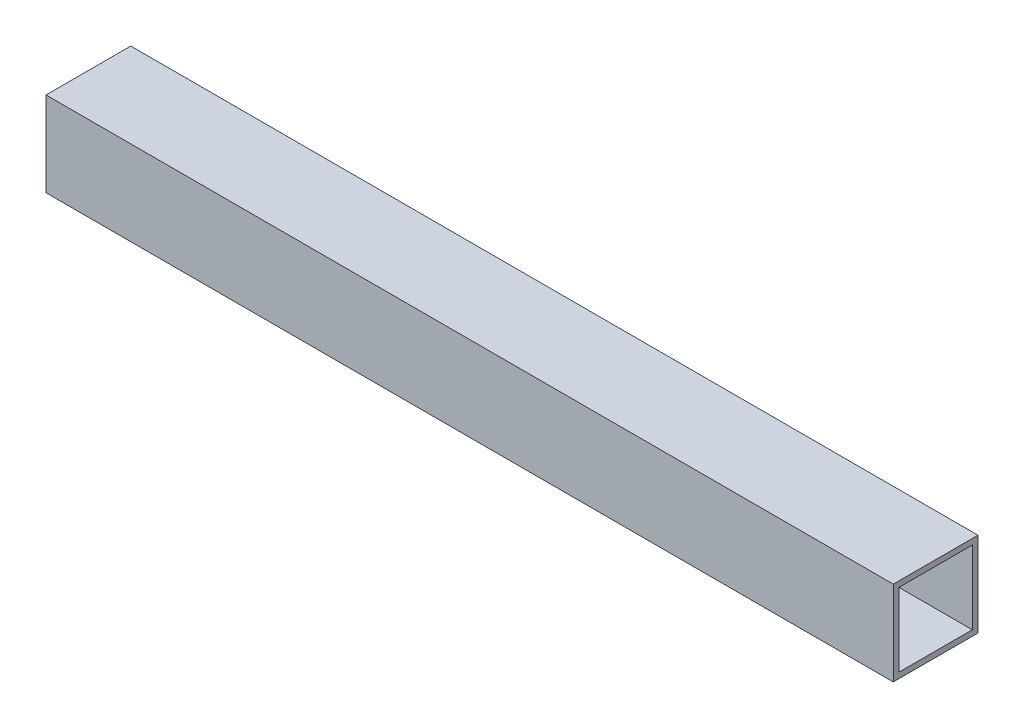
ISO-10303-21;
HEADER;
FILE_DESCRIPTION(('STEP AP214'),'2;1');
FILE_NAME('part.step','',(''),(''),'','','');
FILE_SCHEMA(('AUTOMOTIVE_DESIGN { 1 0 10303 214 1 1 1 1 }'));
ENDSEC;
DATA;
#1=APPLICATION_CONTEXT('core data for automotive mechanical design processes');
#2=APPLICATION_PROTOCOL_DEFINITION('international standard','automotive_design',2000,#1);
#3=PRODUCT_CONTEXT('',#1,'mechanical');
#4=PRODUCT('Part','Part','',(#3));
#5=PRODUCT_RELATED_PRODUCT_CATEGORY('part','',(#4));
#6=PRODUCT_DEFINITION_FORMATION('','',#4);
#7=PRODUCT_DEFINITION_CONTEXT('part definition',#1,'design');
#8=PRODUCT_DEFINITION('design','',#6,#7);
#9=PRODUCT_DEFINITION_SHAPE('','',#8);
#10=(LENGTH_UNIT() NAMED_UNIT(*) SI_UNIT(.MILLI.,.METRE.));
#11=(NAMED_UNIT(*) PLANE_ANGLE_UNIT() SI_UNIT($,.RADIAN.));
#12=(NAMED_UNIT(*) SI_UNIT($,.STERADIAN.) SOLID_ANGLE_UNIT());
#13=UNCERTAINTY_MEASURE_WITH_UNIT(LENGTH_MEASURE(1.E-05),#10,'distance_accuracy_value','');
#14=(GEOMETRIC_REPRESENTATION_CONTEXT(3) GLOBAL_UNCERTAINTY_ASSIGNED_CONTEXT((#13)) GLOBAL_UNIT_ASSIGNED_CONTEXT((#10,
#11,#12)) REPRESENTATION_CONTEXT('',''));
#15=CARTESIAN_POINT('',(0.,0.,0.));
#16=DIRECTION('',(0.,0.,1.));
#17=DIRECTION('',(1.,0.,0.));
#18=AXIS2_PLACEMENT_3D('',#15,#16,#17);
#19=CARTESIAN_POINT('',(75.,0.,0.));
#20=DIRECTION('',(-1.,0.,0.));
#21=DIRECTION('',(0.,0.,1.));
#22=AXIS2_PLACEMENT_3D('',#19,#20,#21);
#23=PLANE('',#22);
#24=DIRECTION('',(0.,-1.,0.));
#25=VECTOR('',#24,1.);
#26=CARTESIAN_POINT('',(75.,7.5,7.5));
#27=LINE('',#26,#25);
#28=CARTESIAN_POINT('',(75.,7.5,7.5));
#29=VERTEX_POINT('',#28);
#30=CARTESIAN_POINT('',(75.,-7.5,7.5));
#31=VERTEX_POINT('',#30);
#32=EDGE_CURVE('E136',#29,#31,#27,.T.);
#33=ORIENTED_EDGE('',*,*,#32,.T.);
#34=DIRECTION('',(0.,0.,-1.));
#35=VECTOR('',#34,1.);
#36=CARTESIAN_POINT('',(75.,-7.5,-7.5));
#37=LINE('',#36,#35);
#38=CARTESIAN_POINT('',(75.,-7.5,-7.5));
#39=VERTEX_POINT('',#38);
#40=EDGE_CURVE('E139',#31,#39,#37,.T.);
#41=ORIENTED_EDGE('',*,*,#40,.T.);
#42=DIRECTION('',(0.,1.,0.));
#43=VECTOR('',#42,1.);
#44=CARTESIAN_POINT('',(75.,7.5,-7.5));
#45=LINE('',#44,#43);
#46=CARTESIAN_POINT('',(75.,7.5,-7.5));
#47=VERTEX_POINT('',#46);
#48=EDGE_CURVE('E142',#39,#47,#45,.T.);
#49=ORIENTED_EDGE('',*,*,#48,.T.);
#50=DIRECTION('',(0.,0.,1.));
#51=VECTOR('',#50,1.);
#52=CARTESIAN_POINT('',(75.,7.5,-7.5));
#53=LINE('',#52,#51);
#54=EDGE_CURVE('E144',#47,#29,#53,.T.);
#55=ORIENTED_EDGE('',*,*,#54,.T.);
#56=EDGE_LOOP('',(#33,#41,#49,#55));
#57=FACE_BOUND('',#56,.T.);
#58=DIRECTION('',(0.,-1.,0.));
#59=VECTOR('',#58,1.);
#60=CARTESIAN_POINT('',(75.,6.5,6.5));
#61=LINE('',#60,#59);
#62=CARTESIAN_POINT('',(75.,6.5,6.5));
#63=VERTEX_POINT('',#62);
#64=CARTESIAN_POINT('',(75.,-6.5,6.5));
#65=VERTEX_POINT('',#64);
#66=EDGE_CURVE('E100',#63,#65,#61,.T.);
#67=ORIENTED_EDGE('',*,*,#66,.F.);
#68=DIRECTION('',(0.,0.,1.));
#69=VECTOR('',#68,1.);
#70=CARTESIAN_POINT('',(75.,6.5,-6.5));
#71=LINE('',#70,#69);
#72=CARTESIAN_POINT('',(75.,6.5,-6.5));
#73=VERTEX_POINT('',#72);
#74=EDGE_CURVE('E122',#73,#63,#71,.T.);
#75=ORIENTED_EDGE('',*,*,#74,.F.);
#76=DIRECTION('',(0.,1.,0.));
#77=VECTOR('',#76,1.);
#78=CARTESIAN_POINT('',(75.,6.5,-6.5));
#79=LINE('',#78,#77);
#80=CARTESIAN_POINT('',(75.,-6.5,-6.5));
#81=VERTEX_POINT('',#80);
#82=EDGE_CURVE('E120',#81,#73,#79,.T.);
#83=ORIENTED_EDGE('',*,*,#82,.F.);
#84=DIRECTION('',(0.,0.,-1.));
#85=VECTOR('',#84,1.);
#86=CARTESIAN_POINT('',(75.,-6.5,-6.5));
#87=LINE('',#86,#85);
#88=EDGE_CURVE('E108',#65,#81,#87,.T.);
#89=ORIENTED_EDGE('',*,*,#88,.F.);
#90=EDGE_LOOP('',(#67,#75,#83,#89));
#91=FACE_BOUND('',#90,.T.);
#92=ADVANCED_FACE('F35',(#57,#91),#23,.F.);
#93=CARTESIAN_POINT('',(-75.,0.,0.));
#94=DIRECTION('',(-1.,0.,0.));
#95=DIRECTION('',(0.,0.,1.));
#96=AXIS2_PLACEMENT_3D('',#93,#94,#95);
#97=PLANE('',#96);
#98=DIRECTION('',(0.,-1.,0.));
#99=VECTOR('',#98,1.);
#100=CARTESIAN_POINT('',(-75.,7.5,7.5));
#101=LINE('',#100,#99);
#102=CARTESIAN_POINT('',(-75.,7.5,7.5));
#103=VERTEX_POINT('',#102);
#104=CARTESIAN_POINT('',(-75.,-7.5,7.5));
#105=VERTEX_POINT('',#104);
#106=EDGE_CURVE('E116',#103,#105,#101,.T.);
#107=ORIENTED_EDGE('',*,*,#106,.F.);
#108=DIRECTION('',(0.,0.,1.));
#109=VECTOR('',#108,1.);
#110=CARTESIAN_POINT('',(-75.,7.5,-7.5));
#111=LINE('',#110,#109);
#112=CARTESIAN_POINT('',(-75.,7.5,-7.5));
#113=VERTEX_POINT('',#112);
#114=EDGE_CURVE('E140',#113,#103,#111,.T.);
#115=ORIENTED_EDGE('',*,*,#114,.F.);
#116=DIRECTION('',(0.,1.,0.));
#117=VECTOR('',#116,1.);
#118=CARTESIAN_POINT('',(-75.,7.5,-7.5));
#119=LINE('',#118,#117);
#120=CARTESIAN_POINT('',(-75.,-7.5,-7.5));
#121=VERTEX_POINT('',#120);
#122=EDGE_CURVE('E151',#121,#113,#119,.T.);
#123=ORIENTED_EDGE('',*,*,#122,.F.);
#124=DIRECTION('',(0.,0.,-1.));
#125=VECTOR('',#124,1.);
#126=CARTESIAN_POINT('',(-75.,-7.5,-7.5));
#127=LINE('',#126,#125);
#128=EDGE_CURVE('E149',#105,#121,#127,.T.);
#129=ORIENTED_EDGE('',*,*,#128,.F.);
#130=EDGE_LOOP('',(#107,#115,#123,#129));
#131=FACE_BOUND('',#130,.T.);
#132=DIRECTION('',(0.,0.,1.));
#133=VECTOR('',#132,1.);
#134=CARTESIAN_POINT('',(-75.,6.5,-6.5));
#135=LINE('',#134,#133);
#136=CARTESIAN_POINT('',(-75.,6.5,-6.5));
#137=VERTEX_POINT('',#136);
#138=CARTESIAN_POINT('',(-75.,6.5,6.5));
#139=VERTEX_POINT('',#138);
#140=EDGE_CURVE('E109',#137,#139,#135,.T.);
#141=ORIENTED_EDGE('',*,*,#140,.T.);
#142=DIRECTION('',(0.,-1.,0.));
#143=VECTOR('',#142,1.);
#144=CARTESIAN_POINT('',(-75.,6.5,6.5));
#145=LINE('',#144,#143);
#146=CARTESIAN_POINT('',(-75.,-6.5,6.5));
#147=VERTEX_POINT('',#146);
#148=EDGE_CURVE('E58',#139,#147,#145,.T.);
#149=ORIENTED_EDGE('',*,*,#148,.T.);
#150=DIRECTION('',(0.,0.,-1.));
#151=VECTOR('',#150,1.);
#152=CARTESIAN_POINT('',(-75.,-6.5,-6.5));
#153=LINE('',#152,#151);
#154=CARTESIAN_POINT('',(-75.,-6.5,-6.5));
#155=VERTEX_POINT('',#154);
#156=EDGE_CURVE('E115',#147,#155,#153,.T.);
#157=ORIENTED_EDGE('',*,*,#156,.T.);
#158=DIRECTION('',(0.,1.,0.));
#159=VECTOR('',#158,1.);
#160=CARTESIAN_POINT('',(-75.,6.5,-6.5));
#161=LINE('',#160,#159);
#162=EDGE_CURVE('E128',#155,#137,#161,.T.);
#163=ORIENTED_EDGE('',*,*,#162,.T.);
#164=EDGE_LOOP('',(#141,#149,#157,#163));
#165=FACE_BOUND('',#164,.T.);
#166=ADVANCED_FACE('F169',(#131,#165),#97,.T.);
#167=CARTESIAN_POINT('',(75.,7.5,7.5));
#168=DIRECTION('',(0.,0.,-1.));
#169=DIRECTION('',(-1.,0.,0.));
#170=AXIS2_PLACEMENT_3D('',#167,#168,#169);
#171=PLANE('',#170);
#172=ORIENTED_EDGE('',*,*,#106,.T.);
#173=DIRECTION('',(-1.,0.,0.));
#174=VECTOR('',#173,1.);
#175=CARTESIAN_POINT('',(75.,-7.5,7.5));
#176=LINE('',#175,#174);
#177=EDGE_CURVE('E11',#31,#105,#176,.T.);
#178=ORIENTED_EDGE('',*,*,#177,.F.);
#179=ORIENTED_EDGE('',*,*,#32,.F.);
#180=DIRECTION('',(-1.,0.,0.));
#181=VECTOR('',#180,1.);
#182=CARTESIAN_POINT('',(75.,7.5,7.5));
#183=LINE('',#182,#181);
#184=EDGE_CURVE('E146',#29,#103,#183,.T.);
#185=ORIENTED_EDGE('',*,*,#184,.T.);
#186=EDGE_LOOP('',(#172,#178,#179,#185));
#187=FACE_BOUND('',#186,.T.);
#188=ADVANCED_FACE('F37',(#187),#171,.F.);
#189=CARTESIAN_POINT('',(75.,-7.5,-7.5));
#190=DIRECTION('',(0.,1.,0.));
#191=DIRECTION('',(0.,0.,1.));
#192=AXIS2_PLACEMENT_3D('',#189,#190,#191);
#193=PLANE('',#192);
#194=ORIENTED_EDGE('',*,*,#128,.T.);
#195=DIRECTION('',(-1.,0.,0.));
#196=VECTOR('',#195,1.);
#197=CARTESIAN_POINT('',(75.,-7.5,-7.5));
#198=LINE('',#197,#196);
#199=EDGE_CURVE('E43',#39,#121,#198,.T.);
#200=ORIENTED_EDGE('',*,*,#199,.F.);
#201=ORIENTED_EDGE('',*,*,#40,.F.);
#202=ORIENTED_EDGE('',*,*,#177,.T.);
#203=EDGE_LOOP('',(#194,#200,#201,#202));
#204=FACE_BOUND('',#203,.T.);
#205=ADVANCED_FACE('F179',(#204),#193,.F.);
#206=CARTESIAN_POINT('',(75.,7.5,-7.5));
#207=DIRECTION('',(0.,0.,1.));
#208=DIRECTION('',(0.,-1.,0.));
#209=AXIS2_PLACEMENT_3D('',#206,#207,#208);
#210=PLANE('',#209);
#211=ORIENTED_EDGE('',*,*,#122,.T.);
#212=DIRECTION('',(-1.,0.,0.));
#213=VECTOR('',#212,1.);
#214=CARTESIAN_POINT('',(75.,7.5,-7.5));
#215=LINE('',#214,#213);
#216=EDGE_CURVE('E156',#47,#113,#215,.T.);
#217=ORIENTED_EDGE('',*,*,#216,.F.);
#218=ORIENTED_EDGE('',*,*,#48,.F.);
#219=ORIENTED_EDGE('',*,*,#199,.T.);
#220=EDGE_LOOP('',(#211,#217,#218,#219));
#221=FACE_BOUND('',#220,.T.);
#222=ADVANCED_FACE('F163',(#221),#210,.F.);
#223=CARTESIAN_POINT('',(75.,7.5,-7.5));
#224=DIRECTION('',(0.,-1.,0.));
#225=DIRECTION('',(0.,0.,-1.));
#226=AXIS2_PLACEMENT_3D('',#223,#224,#225);
#227=PLANE('',#226);
#228=ORIENTED_EDGE('',*,*,#114,.T.);
#229=ORIENTED_EDGE('',*,*,#184,.F.);
#230=ORIENTED_EDGE('',*,*,#54,.F.);
#231=ORIENTED_EDGE('',*,*,#216,.T.);
#232=EDGE_LOOP('',(#228,#229,#230,#231));
#233=FACE_BOUND('',#232,.T.);
#234=ADVANCED_FACE('F173',(#233),#227,.F.);
#235=CARTESIAN_POINT('',(75.,6.5,6.5));
#236=DIRECTION('',(0.,0.,-1.));
#237=DIRECTION('',(-1.,0.,0.));
#238=AXIS2_PLACEMENT_3D('',#235,#236,#237);
#239=PLANE('',#238);
#240=ORIENTED_EDGE('',*,*,#148,.F.);
#241=DIRECTION('',(-1.,0.,0.));
#242=VECTOR('',#241,1.);
#243=CARTESIAN_POINT('',(75.,6.5,6.5));
#244=LINE('',#243,#242);
#245=EDGE_CURVE('E104',#63,#139,#244,.T.);
#246=ORIENTED_EDGE('',*,*,#245,.F.);
#247=ORIENTED_EDGE('',*,*,#66,.T.);
#248=DIRECTION('',(-1.,0.,0.));
#249=VECTOR('',#248,1.);
#250=CARTESIAN_POINT('',(75.,-6.5,6.5));
#251=LINE('',#250,#249);
#252=EDGE_CURVE('E103',#65,#147,#251,.T.);
#253=ORIENTED_EDGE('',*,*,#252,.T.);
#254=EDGE_LOOP('',(#240,#246,#247,#253));
#255=FACE_BOUND('',#254,.T.);
#256=ADVANCED_FACE('F102',(#255),#239,.T.);
#257=CARTESIAN_POINT('',(75.,-6.5,-6.5));
#258=DIRECTION('',(0.,1.,0.));
#259=DIRECTION('',(0.,0.,1.));
#260=AXIS2_PLACEMENT_3D('',#257,#258,#259);
#261=PLANE('',#260);
#262=ORIENTED_EDGE('',*,*,#156,.F.);
#263=ORIENTED_EDGE('',*,*,#252,.F.);
#264=ORIENTED_EDGE('',*,*,#88,.T.);
#265=DIRECTION('',(-1.,0.,0.));
#266=VECTOR('',#265,1.);
#267=CARTESIAN_POINT('',(75.,-6.5,-6.5));
#268=LINE('',#267,#266);
#269=EDGE_CURVE('E117',#81,#155,#268,.T.);
#270=ORIENTED_EDGE('',*,*,#269,.T.);
#271=EDGE_LOOP('',(#262,#263,#264,#270));
#272=FACE_BOUND('',#271,.T.);
#273=ADVANCED_FACE('F112',(#272),#261,.T.);
#274=CARTESIAN_POINT('',(75.,6.5,-6.5));
#275=DIRECTION('',(0.,0.,1.));
#276=DIRECTION('',(1.,0.,0.));
#277=AXIS2_PLACEMENT_3D('',#274,#275,#276);
#278=PLANE('',#277);
#279=ORIENTED_EDGE('',*,*,#162,.F.);
#280=ORIENTED_EDGE('',*,*,#269,.F.);
#281=ORIENTED_EDGE('',*,*,#82,.T.);
#282=DIRECTION('',(-1.,0.,0.));
#283=VECTOR('',#282,1.);
#284=CARTESIAN_POINT('',(75.,6.5,-6.5));
#285=LINE('',#284,#283);
#286=EDGE_CURVE('E50',#73,#137,#285,.T.);
#287=ORIENTED_EDGE('',*,*,#286,.T.);
#288=EDGE_LOOP('',(#279,#280,#281,#287));
#289=FACE_BOUND('',#288,.T.);
#290=ADVANCED_FACE('F202',(#289),#278,.T.);
#291=CARTESIAN_POINT('',(75.,6.5,-6.5));
#292=DIRECTION('',(0.,-1.,0.));
#293=DIRECTION('',(0.,0.,-1.));
#294=AXIS2_PLACEMENT_3D('',#291,#292,#293);
#295=PLANE('',#294);
#296=ORIENTED_EDGE('',*,*,#140,.F.);
#297=ORIENTED_EDGE('',*,*,#286,.F.);
#298=ORIENTED_EDGE('',*,*,#74,.T.);
#299=ORIENTED_EDGE('',*,*,#245,.T.);
#300=EDGE_LOOP('',(#296,#297,#298,#299));
#301=FACE_BOUND('',#300,.T.);
#302=ADVANCED_FACE('F206',(#301),#295,.T.);
#303=CLOSED_SHELL('',(#92,#166,#188,#205,#222,#234,#256,#273,#290,#302));
#304=MANIFOLD_SOLID_BREP('B2',#303);
#305=ADVANCED_BREP_SHAPE_REPRESENTATION('',(#18,#304),#14);
#306=SHAPE_DEFINITION_REPRESENTATION(#9,#305);
ENDSEC;
END-ISO-10303-21;
